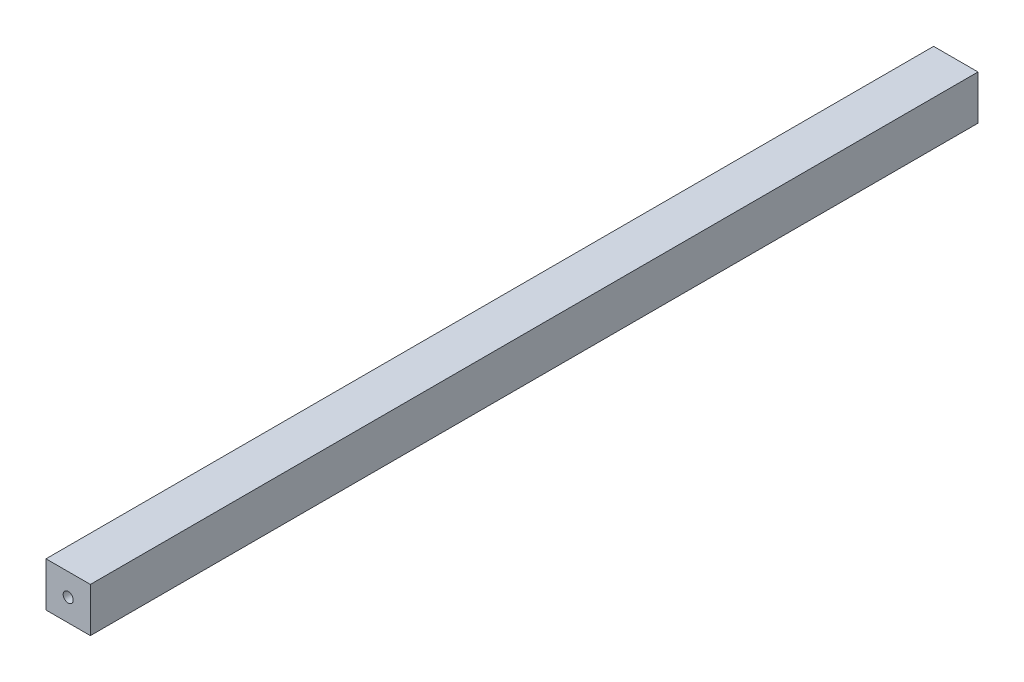
ISO-10303-21;
HEADER;
FILE_DESCRIPTION(('STEP AP214'),'2;1');
FILE_NAME('part.step','',(''),(''),'','','');
FILE_SCHEMA(('AUTOMOTIVE_DESIGN { 1 0 10303 214 1 1 1 1 }'));
ENDSEC;
DATA;
#1=APPLICATION_CONTEXT('core data for automotive mechanical design processes');
#2=APPLICATION_PROTOCOL_DEFINITION('international standard','automotive_design',2000,#1);
#3=PRODUCT_CONTEXT('',#1,'mechanical');
#4=PRODUCT('Part','Part','',(#3));
#5=PRODUCT_RELATED_PRODUCT_CATEGORY('part','',(#4));
#6=PRODUCT_DEFINITION_FORMATION('','',#4);
#7=PRODUCT_DEFINITION_CONTEXT('part definition',#1,'design');
#8=PRODUCT_DEFINITION('design','',#6,#7);
#9=PRODUCT_DEFINITION_SHAPE('','',#8);
#10=(LENGTH_UNIT() NAMED_UNIT(*) SI_UNIT(.MILLI.,.METRE.));
#11=(NAMED_UNIT(*) PLANE_ANGLE_UNIT() SI_UNIT($,.RADIAN.));
#12=(NAMED_UNIT(*) SI_UNIT($,.STERADIAN.) SOLID_ANGLE_UNIT());
#13=UNCERTAINTY_MEASURE_WITH_UNIT(LENGTH_MEASURE(1.E-05),#10,'distance_accuracy_value','');
#14=(GEOMETRIC_REPRESENTATION_CONTEXT(3) GLOBAL_UNCERTAINTY_ASSIGNED_CONTEXT((#13)) GLOBAL_UNIT_ASSIGNED_CONTEXT((#10,
#11,#12)) REPRESENTATION_CONTEXT('',''));
#15=CARTESIAN_POINT('',(0.,0.,0.));
#16=DIRECTION('',(0.,0.,1.));
#17=DIRECTION('',(1.,0.,0.));
#18=AXIS2_PLACEMENT_3D('',#15,#16,#17);
#19=CARTESIAN_POINT('',(0.,0.,-1.));
#20=DIRECTION('',(0.,0.,1.));
#21=DIRECTION('',(1.,0.,0.));
#22=AXIS2_PLACEMENT_3D('',#19,#20,#21);
#23=CYLINDRICAL_SURFACE('',#22,3.4);
#24=CARTESIAN_POINT('',(0.,0.,600.));
#25=DIRECTION('',(0.,0.,1.));
#26=DIRECTION('',(1.,0.,0.));
#27=AXIS2_PLACEMENT_3D('',#24,#25,#26);
#28=CIRCLE('',#27,3.4);
#29=CARTESIAN_POINT('',(3.4,0.,600.));
#30=VERTEX_POINT('',#29);
#31=EDGE_CURVE('E103',#30,#30,#28,.T.);
#32=ORIENTED_EDGE('',*,*,#31,.T.);
#33=EDGE_LOOP('',(#32));
#34=FACE_BOUND('',#33,.T.);
#35=CARTESIAN_POINT('',(0.,0.,0.));
#36=DIRECTION('',(0.,0.,1.));
#37=DIRECTION('',(1.,0.,0.));
#38=AXIS2_PLACEMENT_3D('',#35,#36,#37);
#39=CIRCLE('',#38,3.4);
#40=CARTESIAN_POINT('',(3.4,0.,0.));
#41=VERTEX_POINT('',#40);
#42=EDGE_CURVE('E10',#41,#41,#39,.T.);
#43=ORIENTED_EDGE('',*,*,#42,.F.);
#44=EDGE_LOOP('',(#43));
#45=FACE_BOUND('',#44,.T.);
#46=ADVANCED_FACE('F16',(#34,#45),#23,.F.);
#47=CARTESIAN_POINT('',(15.,-15.,0.));
#48=DIRECTION('',(1.,0.,0.));
#49=DIRECTION('',(0.,1.,0.));
#50=AXIS2_PLACEMENT_3D('',#47,#48,#49);
#51=PLANE('',#50);
#52=DIRECTION('',(0.,0.,1.));
#53=VECTOR('',#52,1.);
#54=CARTESIAN_POINT('',(15.,-15.,0.));
#55=LINE('',#54,#53);
#56=CARTESIAN_POINT('',(15.,-15.,0.));
#57=VERTEX_POINT('',#56);
#58=CARTESIAN_POINT('',(15.,-15.,600.));
#59=VERTEX_POINT('',#58);
#60=EDGE_CURVE('E77',#57,#59,#55,.T.);
#61=ORIENTED_EDGE('',*,*,#60,.F.);
#62=DIRECTION('',(0.,1.,0.));
#63=VECTOR('',#62,1.);
#64=CARTESIAN_POINT('',(15.,-15.,0.));
#65=LINE('',#64,#63);
#66=CARTESIAN_POINT('',(15.,15.,0.));
#67=VERTEX_POINT('',#66);
#68=EDGE_CURVE('E24',#57,#67,#65,.T.);
#69=ORIENTED_EDGE('',*,*,#68,.T.);
#70=DIRECTION('',(0.,0.,1.));
#71=VECTOR('',#70,1.);
#72=CARTESIAN_POINT('',(15.,15.,0.));
#73=LINE('',#72,#71);
#74=CARTESIAN_POINT('',(15.,15.,600.));
#75=VERTEX_POINT('',#74);
#76=EDGE_CURVE('E44',#67,#75,#73,.T.);
#77=ORIENTED_EDGE('',*,*,#76,.T.);
#78=DIRECTION('',(0.,1.,0.));
#79=VECTOR('',#78,1.);
#80=CARTESIAN_POINT('',(15.,-15.,600.));
#81=LINE('',#80,#79);
#82=EDGE_CURVE('E82',#59,#75,#81,.T.);
#83=ORIENTED_EDGE('',*,*,#82,.F.);
#84=EDGE_LOOP('',(#61,#69,#77,#83));
#85=FACE_BOUND('',#84,.T.);
#86=ADVANCED_FACE('F85',(#85),#51,.T.);
#87=CARTESIAN_POINT('',(-15.,-15.,0.));
#88=DIRECTION('',(0.,0.,1.));
#89=DIRECTION('',(1.,0.,0.));
#90=AXIS2_PLACEMENT_3D('',#87,#88,#89);
#91=PLANE('',#90);
#92=ORIENTED_EDGE('',*,*,#42,.T.);
#93=EDGE_LOOP('',(#92));
#94=FACE_BOUND('',#93,.T.);
#95=DIRECTION('',(1.,0.,0.));
#96=VECTOR('',#95,1.);
#97=CARTESIAN_POINT('',(-15.,15.,0.));
#98=LINE('',#97,#96);
#99=CARTESIAN_POINT('',(-15.,15.,0.));
#100=VERTEX_POINT('',#99);
#101=EDGE_CURVE('E70',#100,#67,#98,.T.);
#102=ORIENTED_EDGE('',*,*,#101,.T.);
#103=ORIENTED_EDGE('',*,*,#68,.F.);
#104=DIRECTION('',(1.,0.,0.));
#105=VECTOR('',#104,1.);
#106=CARTESIAN_POINT('',(-15.,-15.,0.));
#107=LINE('',#106,#105);
#108=CARTESIAN_POINT('',(-15.,-15.,0.));
#109=VERTEX_POINT('',#108);
#110=EDGE_CURVE('E68',#109,#57,#107,.T.);
#111=ORIENTED_EDGE('',*,*,#110,.F.);
#112=DIRECTION('',(0.,1.,0.));
#113=VECTOR('',#112,1.);
#114=CARTESIAN_POINT('',(-15.,-15.,0.));
#115=LINE('',#114,#113);
#116=EDGE_CURVE('E95',#109,#100,#115,.T.);
#117=ORIENTED_EDGE('',*,*,#116,.T.);
#118=EDGE_LOOP('',(#102,#103,#111,#117));
#119=FACE_BOUND('',#118,.T.);
#120=ADVANCED_FACE('F66',(#94,#119),#91,.F.);
#121=CARTESIAN_POINT('',(-15.,15.,0.));
#122=DIRECTION('',(0.,1.,0.));
#123=DIRECTION('',(1.,0.,0.));
#124=AXIS2_PLACEMENT_3D('',#121,#122,#123);
#125=PLANE('',#124);
#126=ORIENTED_EDGE('',*,*,#101,.F.);
#127=DIRECTION('',(0.,0.,1.));
#128=VECTOR('',#127,1.);
#129=CARTESIAN_POINT('',(-15.,15.,0.));
#130=LINE('',#129,#128);
#131=CARTESIAN_POINT('',(-15.,15.,600.));
#132=VERTEX_POINT('',#131);
#133=EDGE_CURVE('E118',#100,#132,#130,.T.);
#134=ORIENTED_EDGE('',*,*,#133,.T.);
#135=DIRECTION('',(1.,0.,0.));
#136=VECTOR('',#135,1.);
#137=CARTESIAN_POINT('',(-15.,15.,600.));
#138=LINE('',#137,#136);
#139=EDGE_CURVE('E101',#132,#75,#138,.T.);
#140=ORIENTED_EDGE('',*,*,#139,.T.);
#141=ORIENTED_EDGE('',*,*,#76,.F.);
#142=EDGE_LOOP('',(#126,#134,#140,#141));
#143=FACE_BOUND('',#142,.T.);
#144=ADVANCED_FACE('F129',(#143),#125,.T.);
#145=CARTESIAN_POINT('',(-15.,-15.,600.));
#146=DIRECTION('',(0.,0.,1.));
#147=DIRECTION('',(1.,0.,0.));
#148=AXIS2_PLACEMENT_3D('',#145,#146,#147);
#149=PLANE('',#148);
#150=ORIENTED_EDGE('',*,*,#31,.F.);
#151=EDGE_LOOP('',(#150));
#152=FACE_BOUND('',#151,.T.);
#153=DIRECTION('',(0.,1.,0.));
#154=VECTOR('',#153,1.);
#155=CARTESIAN_POINT('',(-15.,-15.,600.));
#156=LINE('',#155,#154);
#157=CARTESIAN_POINT('',(-15.,-15.,600.));
#158=VERTEX_POINT('',#157);
#159=EDGE_CURVE('E117',#158,#132,#156,.T.);
#160=ORIENTED_EDGE('',*,*,#159,.F.);
#161=DIRECTION('',(1.,0.,0.));
#162=VECTOR('',#161,1.);
#163=CARTESIAN_POINT('',(-15.,-15.,600.));
#164=LINE('',#163,#162);
#165=EDGE_CURVE('E83',#158,#59,#164,.T.);
#166=ORIENTED_EDGE('',*,*,#165,.T.);
#167=ORIENTED_EDGE('',*,*,#82,.T.);
#168=ORIENTED_EDGE('',*,*,#139,.F.);
#169=EDGE_LOOP('',(#160,#166,#167,#168));
#170=FACE_BOUND('',#169,.T.);
#171=ADVANCED_FACE('F131',(#152,#170),#149,.T.);
#172=CARTESIAN_POINT('',(-15.,-15.,0.));
#173=DIRECTION('',(0.,1.,0.));
#174=DIRECTION('',(1.,0.,0.));
#175=AXIS2_PLACEMENT_3D('',#172,#173,#174);
#176=PLANE('',#175);
#177=ORIENTED_EDGE('',*,*,#60,.T.);
#178=ORIENTED_EDGE('',*,*,#165,.F.);
#179=DIRECTION('',(0.,0.,1.));
#180=VECTOR('',#179,1.);
#181=CARTESIAN_POINT('',(-15.,-15.,0.));
#182=LINE('',#181,#180);
#183=EDGE_CURVE('E79',#109,#158,#182,.T.);
#184=ORIENTED_EDGE('',*,*,#183,.F.);
#185=ORIENTED_EDGE('',*,*,#110,.T.);
#186=EDGE_LOOP('',(#177,#178,#184,#185));
#187=FACE_BOUND('',#186,.T.);
#188=ADVANCED_FACE('F75',(#187),#176,.F.);
#189=CARTESIAN_POINT('',(-15.,-15.,0.));
#190=DIRECTION('',(1.,0.,0.));
#191=DIRECTION('',(0.,1.,0.));
#192=AXIS2_PLACEMENT_3D('',#189,#190,#191);
#193=PLANE('',#192);
#194=ORIENTED_EDGE('',*,*,#159,.T.);
#195=ORIENTED_EDGE('',*,*,#133,.F.);
#196=ORIENTED_EDGE('',*,*,#116,.F.);
#197=ORIENTED_EDGE('',*,*,#183,.T.);
#198=EDGE_LOOP('',(#194,#195,#196,#197));
#199=FACE_BOUND('',#198,.T.);
#200=ADVANCED_FACE('F126',(#199),#193,.F.);
#201=CLOSED_SHELL('',(#46,#86,#120,#144,#171,#188,#200));
#202=MANIFOLD_SOLID_BREP('B1',#201);
#203=ADVANCED_BREP_SHAPE_REPRESENTATION('',(#18,#202),#14);
#204=SHAPE_DEFINITION_REPRESENTATION(#9,#203);
ENDSEC;
END-ISO-10303-21;
